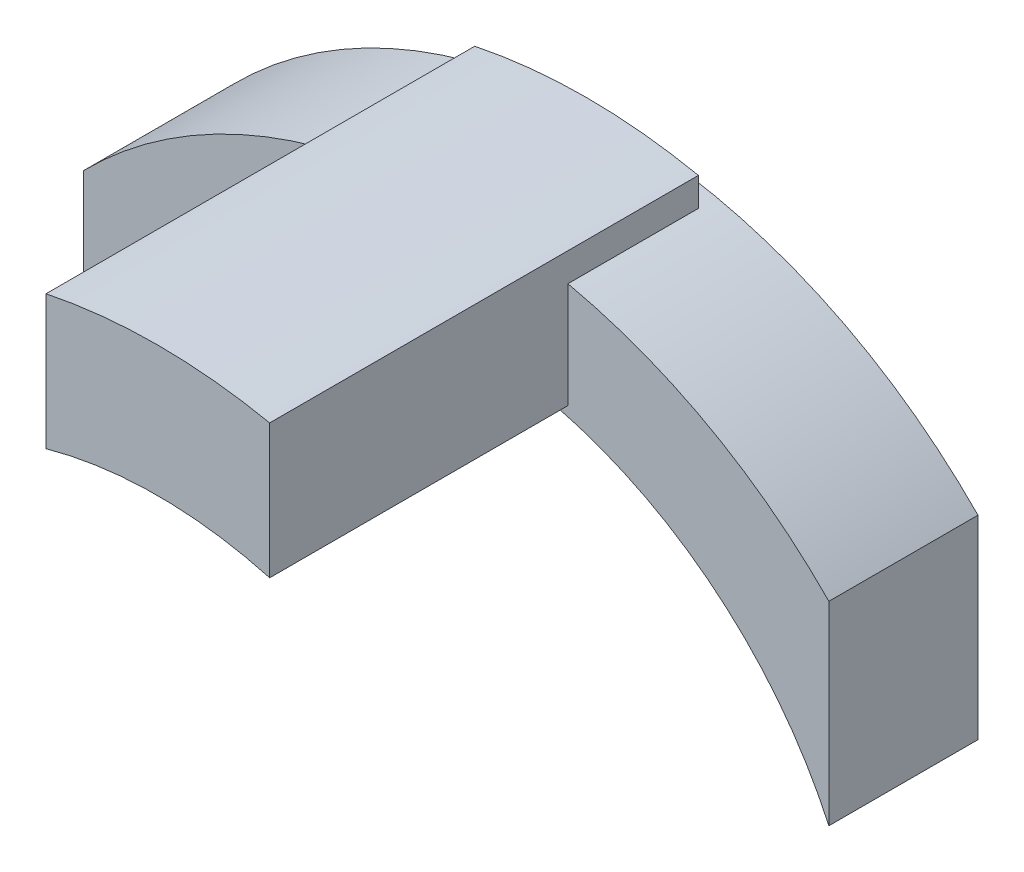
ISO-10303-21;
HEADER;
FILE_DESCRIPTION(('STEP AP214'),'2;1');
FILE_NAME('part.step','',(''),(''),'','','');
FILE_SCHEMA(('AUTOMOTIVE_DESIGN { 1 0 10303 214 1 1 1 1 }'));
ENDSEC;
DATA;
#1=APPLICATION_CONTEXT('core data for automotive mechanical design processes');
#2=APPLICATION_PROTOCOL_DEFINITION('international standard','automotive_design',2000,#1);
#3=PRODUCT_CONTEXT('',#1,'mechanical');
#4=PRODUCT('Part','Part','',(#3));
#5=PRODUCT_RELATED_PRODUCT_CATEGORY('part','',(#4));
#6=PRODUCT_DEFINITION_FORMATION('','',#4);
#7=PRODUCT_DEFINITION_CONTEXT('part definition',#1,'design');
#8=PRODUCT_DEFINITION('design','',#6,#7);
#9=PRODUCT_DEFINITION_SHAPE('','',#8);
#10=(LENGTH_UNIT() NAMED_UNIT(*) SI_UNIT(.MILLI.,.METRE.));
#11=(NAMED_UNIT(*) PLANE_ANGLE_UNIT() SI_UNIT($,.RADIAN.));
#12=(NAMED_UNIT(*) SI_UNIT($,.STERADIAN.) SOLID_ANGLE_UNIT());
#13=UNCERTAINTY_MEASURE_WITH_UNIT(LENGTH_MEASURE(1.E-05),#10,'distance_accuracy_value','');
#14=(GEOMETRIC_REPRESENTATION_CONTEXT(3) GLOBAL_UNCERTAINTY_ASSIGNED_CONTEXT((#13)) GLOBAL_UNIT_ASSIGNED_CONTEXT((#10,
#11,#12)) REPRESENTATION_CONTEXT('',''));
#15=CARTESIAN_POINT('',(0.,0.,0.));
#16=DIRECTION('',(0.,0.,1.));
#17=DIRECTION('',(1.,0.,0.));
#18=AXIS2_PLACEMENT_3D('',#15,#16,#17);
#19=CARTESIAN_POINT('',(0.,0.,4.));
#20=DIRECTION('',(0.,0.,-1.));
#21=DIRECTION('',(-1.,0.,0.));
#22=AXIS2_PLACEMENT_3D('',#19,#20,#21);
#23=CYLINDRICAL_SURFACE('',#22,28.);
#24=DIRECTION('',(0.,0.,-1.));
#25=VECTOR('',#24,1.);
#26=CARTESIAN_POINT('',(-6.00000000000002,27.3495886623547,4.));
#27=LINE('',#26,#25);
#28=CARTESIAN_POINT('',(-6.00000000000002,27.3495886623547,-3.));
#29=VERTEX_POINT('',#28);
#30=CARTESIAN_POINT('',(-6.00000000000002,27.3495886623547,4.));
#31=VERTEX_POINT('',#30);
#32=EDGE_CURVE('E183',#29,#31,#27,.F.);
#33=ORIENTED_EDGE('',*,*,#32,.F.);
#34=CARTESIAN_POINT('',(0.,0.,-3.));
#35=DIRECTION('',(0.,0.,-1.));
#36=DIRECTION('',(-1.,0.,0.));
#37=AXIS2_PLACEMENT_3D('',#34,#35,#36);
#38=CIRCLE('',#37,28.);
#39=CARTESIAN_POINT('',(5.99999999999998,27.3495886623547,-3.));
#40=VERTEX_POINT('',#39);
#41=EDGE_CURVE('E11',#29,#40,#38,.T.);
#42=ORIENTED_EDGE('',*,*,#41,.T.);
#43=DIRECTION('',(0.,0.,-1.));
#44=VECTOR('',#43,1.);
#45=CARTESIAN_POINT('',(5.99999999999998,27.3495886623547,4.));
#46=LINE('',#45,#44);
#47=CARTESIAN_POINT('',(5.99999999999998,27.3495886623547,4.));
#48=VERTEX_POINT('',#47);
#49=EDGE_CURVE('E142',#48,#40,#46,.T.);
#50=ORIENTED_EDGE('',*,*,#49,.F.);
#51=CARTESIAN_POINT('',(0.,0.,4.));
#52=DIRECTION('',(0.,0.,1.));
#53=DIRECTION('',(1.,0.,0.));
#54=AXIS2_PLACEMENT_3D('',#51,#52,#53);
#55=CIRCLE('',#54,28.);
#56=CARTESIAN_POINT('',(20.,19.5959179422654,4.));
#57=VERTEX_POINT('',#56);
#58=EDGE_CURVE('E193',#57,#48,#55,.T.);
#59=ORIENTED_EDGE('',*,*,#58,.F.);
#60=DIRECTION('',(0.,0.,-1.));
#61=VECTOR('',#60,1.);
#62=CARTESIAN_POINT('',(20.,19.5959179422654,4.));
#63=LINE('',#62,#61);
#64=CARTESIAN_POINT('',(20.,19.5959179422654,-4.));
#65=VERTEX_POINT('',#64);
#66=EDGE_CURVE('E216',#57,#65,#63,.T.);
#67=ORIENTED_EDGE('',*,*,#66,.T.);
#68=CARTESIAN_POINT('',(0.,0.,-4.));
#69=DIRECTION('',(0.,0.,1.));
#70=DIRECTION('',(1.,0.,0.));
#71=AXIS2_PLACEMENT_3D('',#68,#69,#70);
#72=CIRCLE('',#71,28.);
#73=CARTESIAN_POINT('',(-20.,19.5959179422654,-4.));
#74=VERTEX_POINT('',#73);
#75=EDGE_CURVE('E206',#65,#74,#72,.T.);
#76=ORIENTED_EDGE('',*,*,#75,.T.);
#77=DIRECTION('',(0.,0.,-1.));
#78=VECTOR('',#77,1.);
#79=CARTESIAN_POINT('',(-20.,19.5959179422654,4.));
#80=LINE('',#79,#78);
#81=CARTESIAN_POINT('',(-20.,19.5959179422654,4.));
#82=VERTEX_POINT('',#81);
#83=EDGE_CURVE('E213',#82,#74,#80,.T.);
#84=ORIENTED_EDGE('',*,*,#83,.F.);
#85=EDGE_CURVE('E192',#31,#82,#55,.T.);
#86=ORIENTED_EDGE('',*,*,#85,.F.);
#87=EDGE_LOOP('',(#33,#42,#50,#59,#67,#76,#84,#86));
#88=FACE_BOUND('',#87,.T.);
#89=ADVANCED_FACE('F43',(#88),#23,.T.);
#90=CARTESIAN_POINT('',(0.,0.,4.));
#91=DIRECTION('',(0.,0.,1.));
#92=DIRECTION('',(1.,0.,0.));
#93=AXIS2_PLACEMENT_3D('',#90,#91,#92);
#94=PLANE('',#93);
#95=CARTESIAN_POINT('',(0.,0.,4.));
#96=DIRECTION('',(0.,0.,1.));
#97=DIRECTION('',(1.,0.,0.));
#98=AXIS2_PLACEMENT_3D('',#95,#96,#97);
#99=CIRCLE('',#98,22.5);
#100=CARTESIAN_POINT('',(5.99999999999998,21.6852484422014,4.));
#101=VERTEX_POINT('',#100);
#102=CARTESIAN_POINT('',(-6.00000000000002,21.6852484422014,4.));
#103=VERTEX_POINT('',#102);
#104=EDGE_CURVE('E227',#101,#103,#99,.T.);
#105=ORIENTED_EDGE('',*,*,#104,.T.);
#106=DIRECTION('',(0.,1.,0.));
#107=VECTOR('',#106,1.);
#108=CARTESIAN_POINT('',(-6.00000000000002,0.,4.));
#109=LINE('',#108,#107);
#110=EDGE_CURVE('E52',#103,#31,#109,.T.);
#111=ORIENTED_EDGE('',*,*,#110,.T.);
#112=ORIENTED_EDGE('',*,*,#85,.T.);
#113=DIRECTION('',(0.,-1.,0.));
#114=VECTOR('',#113,1.);
#115=CARTESIAN_POINT('',(-20.,9.16515138991168,4.));
#116=LINE('',#115,#114);
#117=CARTESIAN_POINT('',(-20.,9.16515138991168,4.));
#118=VERTEX_POINT('',#117);
#119=EDGE_CURVE('E68',#82,#118,#116,.T.);
#120=ORIENTED_EDGE('',*,*,#119,.T.);
#121=CARTESIAN_POINT('',(0.,0.,4.));
#122=DIRECTION('',(0.,0.,-1.));
#123=DIRECTION('',(1.,0.,0.));
#124=AXIS2_PLACEMENT_3D('',#121,#122,#123);
#125=CIRCLE('',#124,22.);
#126=CARTESIAN_POINT('',(20.,9.16515138991168,4.));
#127=VERTEX_POINT('',#126);
#128=EDGE_CURVE('E187',#118,#127,#125,.T.);
#129=ORIENTED_EDGE('',*,*,#128,.T.);
#130=DIRECTION('',(0.,1.,0.));
#131=VECTOR('',#130,1.);
#132=CARTESIAN_POINT('',(20.,19.5959179422654,4.));
#133=LINE('',#132,#131);
#134=EDGE_CURVE('E97',#127,#57,#133,.T.);
#135=ORIENTED_EDGE('',*,*,#134,.T.);
#136=ORIENTED_EDGE('',*,*,#58,.T.);
#137=DIRECTION('',(0.,-1.,0.));
#138=VECTOR('',#137,1.);
#139=CARTESIAN_POINT('',(5.99999999999998,0.,4.));
#140=LINE('',#139,#138);
#141=EDGE_CURVE('E223',#48,#101,#140,.T.);
#142=ORIENTED_EDGE('',*,*,#141,.T.);
#143=EDGE_LOOP('',(#105,#111,#112,#120,#129,#135,#136,#142));
#144=FACE_BOUND('',#143,.T.);
#145=ADVANCED_FACE('F231',(#144),#94,.T.);
#146=CARTESIAN_POINT('',(0.,0.,4.));
#147=DIRECTION('',(0.,0.,-1.));
#148=DIRECTION('',(-1.,0.,0.));
#149=AXIS2_PLACEMENT_3D('',#146,#147,#148);
#150=CYLINDRICAL_SURFACE('',#149,22.);
#151=CARTESIAN_POINT('',(0.,0.,-4.));
#152=DIRECTION('',(0.,0.,-1.));
#153=DIRECTION('',(1.,0.,0.));
#154=AXIS2_PLACEMENT_3D('',#151,#152,#153);
#155=CIRCLE('',#154,22.);
#156=CARTESIAN_POINT('',(-20.,9.16515138991168,-4.));
#157=VERTEX_POINT('',#156);
#158=CARTESIAN_POINT('',(20.,9.16515138991168,-4.));
#159=VERTEX_POINT('',#158);
#160=EDGE_CURVE('E186',#157,#159,#155,.T.);
#161=ORIENTED_EDGE('',*,*,#160,.T.);
#162=DIRECTION('',(0.,0.,-1.));
#163=VECTOR('',#162,1.);
#164=CARTESIAN_POINT('',(20.,9.16515138991168,4.));
#165=LINE('',#164,#163);
#166=EDGE_CURVE('E220',#127,#159,#165,.T.);
#167=ORIENTED_EDGE('',*,*,#166,.F.);
#168=ORIENTED_EDGE('',*,*,#128,.F.);
#169=DIRECTION('',(0.,0.,-1.));
#170=VECTOR('',#169,1.);
#171=CARTESIAN_POINT('',(-20.,9.16515138991168,4.));
#172=LINE('',#171,#170);
#173=EDGE_CURVE('E199',#118,#157,#172,.T.);
#174=ORIENTED_EDGE('',*,*,#173,.T.);
#175=EDGE_LOOP('',(#161,#167,#168,#174));
#176=FACE_BOUND('',#175,.T.);
#177=ADVANCED_FACE('F45',(#176),#150,.F.);
#178=CARTESIAN_POINT('',(20.,19.5959179422654,4.));
#179=DIRECTION('',(-1.,0.,0.));
#180=DIRECTION('',(0.,0.,1.));
#181=AXIS2_PLACEMENT_3D('',#178,#179,#180);
#182=PLANE('',#181);
#183=DIRECTION('',(0.,1.,0.));
#184=VECTOR('',#183,1.);
#185=CARTESIAN_POINT('',(20.,19.5959179422654,-4.));
#186=LINE('',#185,#184);
#187=EDGE_CURVE('E203',#159,#65,#186,.T.);
#188=ORIENTED_EDGE('',*,*,#187,.T.);
#189=ORIENTED_EDGE('',*,*,#66,.F.);
#190=ORIENTED_EDGE('',*,*,#134,.F.);
#191=ORIENTED_EDGE('',*,*,#166,.T.);
#192=EDGE_LOOP('',(#188,#189,#190,#191));
#193=FACE_BOUND('',#192,.T.);
#194=ADVANCED_FACE('F243',(#193),#182,.F.);
#195=CARTESIAN_POINT('',(-20.,9.16515138991168,4.));
#196=DIRECTION('',(1.,0.,0.));
#197=DIRECTION('',(0.,0.,-1.));
#198=AXIS2_PLACEMENT_3D('',#195,#196,#197);
#199=PLANE('',#198);
#200=DIRECTION('',(0.,-1.,0.));
#201=VECTOR('',#200,1.);
#202=CARTESIAN_POINT('',(-20.,9.16515138991168,-4.));
#203=LINE('',#202,#201);
#204=EDGE_CURVE('E89',#74,#157,#203,.T.);
#205=ORIENTED_EDGE('',*,*,#204,.T.);
#206=ORIENTED_EDGE('',*,*,#173,.F.);
#207=ORIENTED_EDGE('',*,*,#119,.F.);
#208=ORIENTED_EDGE('',*,*,#83,.T.);
#209=EDGE_LOOP('',(#205,#206,#207,#208));
#210=FACE_BOUND('',#209,.T.);
#211=ADVANCED_FACE('F237',(#210),#199,.F.);
#212=CARTESIAN_POINT('',(0.,0.,-4.));
#213=DIRECTION('',(0.,0.,1.));
#214=DIRECTION('',(1.,0.,0.));
#215=AXIS2_PLACEMENT_3D('',#212,#213,#214);
#216=PLANE('',#215);
#217=ORIENTED_EDGE('',*,*,#160,.F.);
#218=ORIENTED_EDGE('',*,*,#204,.F.);
#219=ORIENTED_EDGE('',*,*,#75,.F.);
#220=ORIENTED_EDGE('',*,*,#187,.F.);
#221=EDGE_LOOP('',(#217,#218,#219,#220));
#222=FACE_BOUND('',#221,.T.);
#223=ADVANCED_FACE('F276',(#222),#216,.F.);
#224=CARTESIAN_POINT('',(0.,0.,-3.));
#225=DIRECTION('',(0.,0.,-1.));
#226=DIRECTION('',(-1.,0.,0.));
#227=AXIS2_PLACEMENT_3D('',#224,#225,#226);
#228=PLANE('',#227);
#229=ORIENTED_EDGE('',*,*,#41,.F.);
#230=DIRECTION('',(0.,1.,0.));
#231=VECTOR('',#230,1.);
#232=CARTESIAN_POINT('',(-6.00000000000002,21.6852484422014,-3.));
#233=LINE('',#232,#231);
#234=CARTESIAN_POINT('',(-6.00000000000002,28.8833862280724,-3.));
#235=VERTEX_POINT('',#234);
#236=EDGE_CURVE('E164',#29,#235,#233,.T.);
#237=ORIENTED_EDGE('',*,*,#236,.T.);
#238=CARTESIAN_POINT('',(0.,0.,-3.));
#239=DIRECTION('',(0.,0.,-1.));
#240=DIRECTION('',(-1.,0.,0.));
#241=AXIS2_PLACEMENT_3D('',#238,#239,#240);
#242=CIRCLE('',#241,29.5);
#243=CARTESIAN_POINT('',(5.99999999999998,28.8833862280724,-3.));
#244=VERTEX_POINT('',#243);
#245=EDGE_CURVE('E167',#235,#244,#242,.T.);
#246=ORIENTED_EDGE('',*,*,#245,.T.);
#247=DIRECTION('',(0.,-1.,0.));
#248=VECTOR('',#247,1.);
#249=CARTESIAN_POINT('',(5.99999999999998,28.8833862280724,-3.));
#250=LINE('',#249,#248);
#251=EDGE_CURVE('E170',#244,#40,#250,.T.);
#252=ORIENTED_EDGE('',*,*,#251,.T.);
#253=EDGE_LOOP('',(#229,#237,#246,#252));
#254=FACE_BOUND('',#253,.T.);
#255=ADVANCED_FACE('F248',(#254),#228,.T.);
#256=CARTESIAN_POINT('',(-6.00000000000002,21.6852484422014,-3.));
#257=DIRECTION('',(1.,0.,0.));
#258=DIRECTION('',(0.,0.,-1.));
#259=AXIS2_PLACEMENT_3D('',#256,#257,#258);
#260=PLANE('',#259);
#261=ORIENTED_EDGE('',*,*,#236,.F.);
#262=ORIENTED_EDGE('',*,*,#32,.T.);
#263=ORIENTED_EDGE('',*,*,#110,.F.);
#264=DIRECTION('',(0.,0.,1.));
#265=VECTOR('',#264,1.);
#266=CARTESIAN_POINT('',(-6.00000000000002,21.6852484422014,-3.));
#267=LINE('',#266,#265);
#268=CARTESIAN_POINT('',(-6.00000000000002,21.6852484422014,20.));
#269=VERTEX_POINT('',#268);
#270=EDGE_CURVE('E131',#103,#269,#267,.T.);
#271=ORIENTED_EDGE('',*,*,#270,.T.);
#272=DIRECTION('',(0.,1.,0.));
#273=VECTOR('',#272,1.);
#274=CARTESIAN_POINT('',(-6.00000000000002,21.6852484422014,20.));
#275=LINE('',#274,#273);
#276=CARTESIAN_POINT('',(-6.00000000000002,28.8833862280724,20.));
#277=VERTEX_POINT('',#276);
#278=EDGE_CURVE('E136',#269,#277,#275,.T.);
#279=ORIENTED_EDGE('',*,*,#278,.T.);
#280=DIRECTION('',(0.,0.,1.));
#281=VECTOR('',#280,1.);
#282=CARTESIAN_POINT('',(-6.00000000000002,28.8833862280724,-3.));
#283=LINE('',#282,#281);
#284=EDGE_CURVE('E143',#235,#277,#283,.T.);
#285=ORIENTED_EDGE('',*,*,#284,.F.);
#286=EDGE_LOOP('',(#261,#262,#263,#271,#279,#285));
#287=FACE_BOUND('',#286,.T.);
#288=ADVANCED_FACE('F134',(#287),#260,.F.);
#289=CARTESIAN_POINT('',(5.99999999999998,28.8833862280724,-3.));
#290=DIRECTION('',(-1.,0.,0.));
#291=DIRECTION('',(0.,0.,1.));
#292=AXIS2_PLACEMENT_3D('',#289,#290,#291);
#293=PLANE('',#292);
#294=ORIENTED_EDGE('',*,*,#141,.F.);
#295=ORIENTED_EDGE('',*,*,#49,.T.);
#296=ORIENTED_EDGE('',*,*,#251,.F.);
#297=DIRECTION('',(0.,0.,1.));
#298=VECTOR('',#297,1.);
#299=CARTESIAN_POINT('',(5.99999999999998,28.8833862280724,-3.));
#300=LINE('',#299,#298);
#301=CARTESIAN_POINT('',(5.99999999999998,28.8833862280724,20.));
#302=VERTEX_POINT('',#301);
#303=EDGE_CURVE('E176',#244,#302,#300,.T.);
#304=ORIENTED_EDGE('',*,*,#303,.T.);
#305=DIRECTION('',(0.,-1.,0.));
#306=VECTOR('',#305,1.);
#307=CARTESIAN_POINT('',(5.99999999999998,28.8833862280724,20.));
#308=LINE('',#307,#306);
#309=CARTESIAN_POINT('',(5.99999999999998,21.6852484422014,20.));
#310=VERTEX_POINT('',#309);
#311=EDGE_CURVE('E161',#302,#310,#308,.T.);
#312=ORIENTED_EDGE('',*,*,#311,.T.);
#313=DIRECTION('',(0.,0.,1.));
#314=VECTOR('',#313,1.);
#315=CARTESIAN_POINT('',(5.99999999999998,21.6852484422014,-3.));
#316=LINE('',#315,#314);
#317=EDGE_CURVE('E59',#101,#310,#316,.T.);
#318=ORIENTED_EDGE('',*,*,#317,.F.);
#319=EDGE_LOOP('',(#294,#295,#296,#304,#312,#318));
#320=FACE_BOUND('',#319,.T.);
#321=ADVANCED_FACE('F246',(#320),#293,.F.);
#322=CARTESIAN_POINT('',(0.,0.,-3.));
#323=DIRECTION('',(0.,0.,1.));
#324=DIRECTION('',(1.,0.,0.));
#325=AXIS2_PLACEMENT_3D('',#322,#323,#324);
#326=CYLINDRICAL_SURFACE('',#325,22.5);
#327=ORIENTED_EDGE('',*,*,#104,.F.);
#328=ORIENTED_EDGE('',*,*,#317,.T.);
#329=CARTESIAN_POINT('',(0.,0.,20.));
#330=DIRECTION('',(0.,0.,1.));
#331=DIRECTION('',(-1.,0.,0.));
#332=AXIS2_PLACEMENT_3D('',#329,#330,#331);
#333=CIRCLE('',#332,22.5);
#334=EDGE_CURVE('E150',#310,#269,#333,.T.);
#335=ORIENTED_EDGE('',*,*,#334,.T.);
#336=ORIENTED_EDGE('',*,*,#270,.F.);
#337=EDGE_LOOP('',(#327,#328,#335,#336));
#338=FACE_BOUND('',#337,.T.);
#339=ADVANCED_FACE('F155',(#338),#326,.F.);
#340=CARTESIAN_POINT('',(0.,0.,-3.));
#341=DIRECTION('',(0.,0.,1.));
#342=DIRECTION('',(1.,0.,0.));
#343=AXIS2_PLACEMENT_3D('',#340,#341,#342);
#344=CYLINDRICAL_SURFACE('',#343,29.5);
#345=ORIENTED_EDGE('',*,*,#284,.T.);
#346=CARTESIAN_POINT('',(0.,0.,20.));
#347=DIRECTION('',(0.,0.,-1.));
#348=DIRECTION('',(-1.,0.,0.));
#349=AXIS2_PLACEMENT_3D('',#346,#347,#348);
#350=CIRCLE('',#349,29.5);
#351=EDGE_CURVE('E152',#277,#302,#350,.T.);
#352=ORIENTED_EDGE('',*,*,#351,.T.);
#353=ORIENTED_EDGE('',*,*,#303,.F.);
#354=ORIENTED_EDGE('',*,*,#245,.F.);
#355=EDGE_LOOP('',(#345,#352,#353,#354));
#356=FACE_BOUND('',#355,.T.);
#357=ADVANCED_FACE('F252',(#356),#344,.T.);
#358=CARTESIAN_POINT('',(0.,0.,20.));
#359=DIRECTION('',(0.,0.,-1.));
#360=DIRECTION('',(-1.,0.,0.));
#361=AXIS2_PLACEMENT_3D('',#358,#359,#360);
#362=PLANE('',#361);
#363=ORIENTED_EDGE('',*,*,#334,.F.);
#364=ORIENTED_EDGE('',*,*,#311,.F.);
#365=ORIENTED_EDGE('',*,*,#351,.F.);
#366=ORIENTED_EDGE('',*,*,#278,.F.);
#367=EDGE_LOOP('',(#363,#364,#365,#366));
#368=FACE_BOUND('',#367,.T.);
#369=ADVANCED_FACE('F148',(#368),#362,.F.);
#370=CLOSED_SHELL('',(#89,#145,#177,#194,#211,#223,#255,#288,#321,#339,#357,#369));
#371=MANIFOLD_SOLID_BREP('B2',#370);
#372=ADVANCED_BREP_SHAPE_REPRESENTATION('',(#18,#371),#14);
#373=SHAPE_DEFINITION_REPRESENTATION(#9,#372);
ENDSEC;
END-ISO-10303-21;
